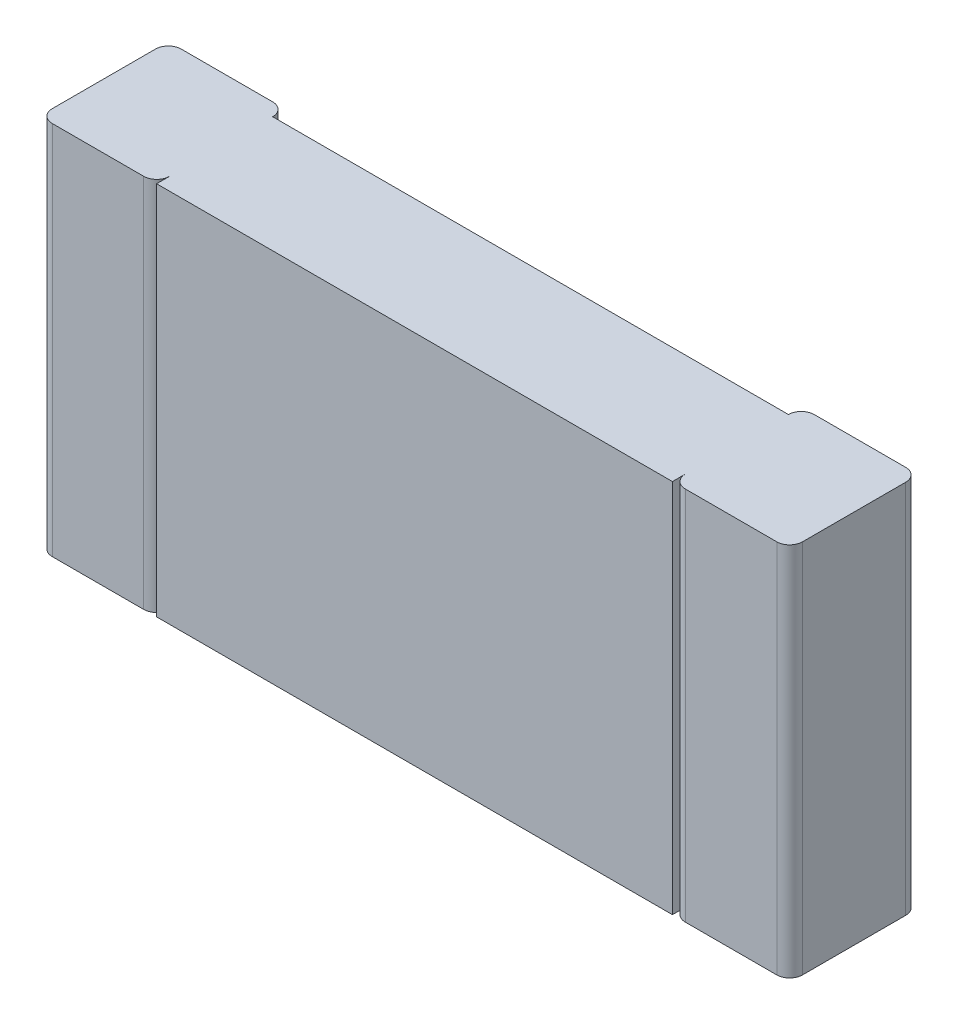
ISO-10303-21;
HEADER;
FILE_DESCRIPTION(('STEP AP214'),'2;1');
FILE_NAME('part.step','',(''),(''),'','','');
FILE_SCHEMA(('AUTOMOTIVE_DESIGN { 1 0 10303 214 1 1 1 1 }'));
ENDSEC;
DATA;
#1=APPLICATION_CONTEXT('core data for automotive mechanical design processes');
#2=APPLICATION_PROTOCOL_DEFINITION('international standard','automotive_design',2000,#1);
#3=PRODUCT_CONTEXT('',#1,'mechanical');
#4=PRODUCT('Part','Part','',(#3));
#5=PRODUCT_RELATED_PRODUCT_CATEGORY('part','',(#4));
#6=PRODUCT_DEFINITION_FORMATION('','',#4);
#7=PRODUCT_DEFINITION_CONTEXT('part definition',#1,'design');
#8=PRODUCT_DEFINITION('design','',#6,#7);
#9=PRODUCT_DEFINITION_SHAPE('','',#8);
#10=(LENGTH_UNIT() NAMED_UNIT(*) SI_UNIT(.MILLI.,.METRE.));
#11=(NAMED_UNIT(*) PLANE_ANGLE_UNIT() SI_UNIT($,.RADIAN.));
#12=(NAMED_UNIT(*) SI_UNIT($,.STERADIAN.) SOLID_ANGLE_UNIT());
#13=UNCERTAINTY_MEASURE_WITH_UNIT(LENGTH_MEASURE(1.E-05),#10,'distance_accuracy_value','');
#14=(GEOMETRIC_REPRESENTATION_CONTEXT(3) GLOBAL_UNCERTAINTY_ASSIGNED_CONTEXT((#13)) GLOBAL_UNIT_ASSIGNED_CONTEXT((#10,
#11,#12)) REPRESENTATION_CONTEXT('',''));
#15=CARTESIAN_POINT('',(0.,0.,0.));
#16=DIRECTION('',(0.,0.,1.));
#17=DIRECTION('',(1.,0.,0.));
#18=AXIS2_PLACEMENT_3D('',#15,#16,#17);
#19=CARTESIAN_POINT('',(-1.545,-0.8,0.055));
#20=DIRECTION('',(0.,1.,0.));
#21=DIRECTION('',(0.,0.,1.));
#22=AXIS2_PLACEMENT_3D('',#19,#20,#21);
#23=CYLINDRICAL_SURFACE('',#22,0.055);
#24=DIRECTION('',(0.,1.,0.));
#25=VECTOR('',#24,1.);
#26=CARTESIAN_POINT('',(-1.545,-0.8,0.));
#27=LINE('',#26,#25);
#28=CARTESIAN_POINT('',(-1.545,0.8,0.));
#29=VERTEX_POINT('',#28);
#30=CARTESIAN_POINT('',(-1.545,-0.8,0.));
#31=VERTEX_POINT('',#30);
#32=EDGE_CURVE('E179',#29,#31,#27,.F.);
#33=ORIENTED_EDGE('',*,*,#32,.T.);
#34=CARTESIAN_POINT('',(-1.545,-0.8,0.055));
#35=DIRECTION('',(0.,1.,0.));
#36=DIRECTION('',(0.,0.,1.));
#37=AXIS2_PLACEMENT_3D('',#34,#35,#36);
#38=CIRCLE('',#37,0.055);
#39=CARTESIAN_POINT('',(-1.6,-0.8,0.055));
#40=VERTEX_POINT('',#39);
#41=EDGE_CURVE('E152',#31,#40,#38,.T.);
#42=ORIENTED_EDGE('',*,*,#41,.T.);
#43=DIRECTION('',(0.,1.,0.));
#44=VECTOR('',#43,1.);
#45=CARTESIAN_POINT('',(-1.6,-0.8,0.055));
#46=LINE('',#45,#44);
#47=CARTESIAN_POINT('',(-1.6,0.8,0.055));
#48=VERTEX_POINT('',#47);
#49=EDGE_CURVE('E155',#40,#48,#46,.T.);
#50=ORIENTED_EDGE('',*,*,#49,.T.);
#51=CARTESIAN_POINT('',(-1.545,0.8,0.055));
#52=DIRECTION('',(0.,1.,0.));
#53=DIRECTION('',(0.,0.,1.));
#54=AXIS2_PLACEMENT_3D('',#51,#52,#53);
#55=CIRCLE('',#54,0.055);
#56=EDGE_CURVE('E22',#48,#29,#55,.F.);
#57=ORIENTED_EDGE('',*,*,#56,.T.);
#58=EDGE_LOOP('',(#33,#42,#50,#57));
#59=FACE_BOUND('',#58,.T.);
#60=ADVANCED_FACE('F19',(#59),#23,.T.);
#61=CARTESIAN_POINT('',(1.545,-0.8,0.055));
#62=DIRECTION('',(0.,1.,0.));
#63=DIRECTION('',(0.,0.,1.));
#64=AXIS2_PLACEMENT_3D('',#61,#62,#63);
#65=CYLINDRICAL_SURFACE('',#64,0.055);
#66=CARTESIAN_POINT('',(1.545,0.8,0.055));
#67=DIRECTION('',(0.,1.,0.));
#68=DIRECTION('',(0.,0.,1.));
#69=AXIS2_PLACEMENT_3D('',#66,#67,#68);
#70=CIRCLE('',#69,0.055);
#71=CARTESIAN_POINT('',(1.545,0.8,0.));
#72=VERTEX_POINT('',#71);
#73=CARTESIAN_POINT('',(1.6,0.8,0.055));
#74=VERTEX_POINT('',#73);
#75=EDGE_CURVE('E173',#72,#74,#70,.F.);
#76=ORIENTED_EDGE('',*,*,#75,.T.);
#77=DIRECTION('',(0.,1.,0.));
#78=VECTOR('',#77,1.);
#79=CARTESIAN_POINT('',(1.6,-0.8,0.055));
#80=LINE('',#79,#78);
#81=CARTESIAN_POINT('',(1.6,-0.8,0.055));
#82=VERTEX_POINT('',#81);
#83=EDGE_CURVE('E167',#82,#74,#80,.T.);
#84=ORIENTED_EDGE('',*,*,#83,.F.);
#85=CARTESIAN_POINT('',(1.545,-0.8,0.055));
#86=DIRECTION('',(0.,1.,0.));
#87=DIRECTION('',(0.,0.,1.));
#88=AXIS2_PLACEMENT_3D('',#85,#86,#87);
#89=CIRCLE('',#88,0.055);
#90=CARTESIAN_POINT('',(1.545,-0.8,0.));
#91=VERTEX_POINT('',#90);
#92=EDGE_CURVE('E225',#82,#91,#89,.T.);
#93=ORIENTED_EDGE('',*,*,#92,.T.);
#94=DIRECTION('',(0.,1.,0.));
#95=VECTOR('',#94,1.);
#96=CARTESIAN_POINT('',(1.545,-0.8,0.));
#97=LINE('',#96,#95);
#98=EDGE_CURVE('E174',#91,#72,#97,.T.);
#99=ORIENTED_EDGE('',*,*,#98,.T.);
#100=EDGE_LOOP('',(#76,#84,#93,#99));
#101=FACE_BOUND('',#100,.T.);
#102=ADVANCED_FACE('F230',(#101),#65,.T.);
#103=CARTESIAN_POINT('',(-1.6,-0.8,0.));
#104=DIRECTION('',(1.,0.,0.));
#105=DIRECTION('',(0.,0.,-1.));
#106=AXIS2_PLACEMENT_3D('',#103,#104,#105);
#107=PLANE('',#106);
#108=DIRECTION('',(0.,0.,-1.));
#109=VECTOR('',#108,1.);
#110=CARTESIAN_POINT('',(-1.6,0.8,0.));
#111=LINE('',#110,#109);
#112=CARTESIAN_POINT('',(-1.6,0.8,0.495));
#113=VERTEX_POINT('',#112);
#114=EDGE_CURVE('E145',#48,#113,#111,.F.);
#115=ORIENTED_EDGE('',*,*,#114,.F.);
#116=ORIENTED_EDGE('',*,*,#49,.F.);
#117=DIRECTION('',(0.,0.,-1.));
#118=VECTOR('',#117,1.);
#119=CARTESIAN_POINT('',(-1.6,-0.8,0.));
#120=LINE('',#119,#118);
#121=CARTESIAN_POINT('',(-1.6,-0.8,0.495));
#122=VERTEX_POINT('',#121);
#123=EDGE_CURVE('E158',#122,#40,#120,.T.);
#124=ORIENTED_EDGE('',*,*,#123,.F.);
#125=DIRECTION('',(0.,1.,0.));
#126=VECTOR('',#125,1.);
#127=CARTESIAN_POINT('',(-1.6,-0.8,0.495));
#128=LINE('',#127,#126);
#129=EDGE_CURVE('E162',#113,#122,#128,.F.);
#130=ORIENTED_EDGE('',*,*,#129,.F.);
#131=EDGE_LOOP('',(#115,#116,#124,#130));
#132=FACE_BOUND('',#131,.T.);
#133=ADVANCED_FACE('F160',(#132),#107,.F.);
#134=CARTESIAN_POINT('',(1.6,-0.8,0.));
#135=DIRECTION('',(1.,0.,0.));
#136=DIRECTION('',(0.,0.,-1.));
#137=AXIS2_PLACEMENT_3D('',#134,#135,#136);
#138=PLANE('',#137);
#139=DIRECTION('',(0.,0.,-1.));
#140=VECTOR('',#139,1.);
#141=CARTESIAN_POINT('',(1.6,0.8,0.));
#142=LINE('',#141,#140);
#143=CARTESIAN_POINT('',(1.6,0.8,0.495));
#144=VERTEX_POINT('',#143);
#145=EDGE_CURVE('E183',#74,#144,#142,.F.);
#146=ORIENTED_EDGE('',*,*,#145,.T.);
#147=DIRECTION('',(0.,1.,0.));
#148=VECTOR('',#147,1.);
#149=CARTESIAN_POINT('',(1.6,-0.8,0.495));
#150=LINE('',#149,#148);
#151=CARTESIAN_POINT('',(1.6,-0.8,0.495));
#152=VERTEX_POINT('',#151);
#153=EDGE_CURVE('E220',#152,#144,#150,.T.);
#154=ORIENTED_EDGE('',*,*,#153,.F.);
#155=DIRECTION('',(0.,0.,-1.));
#156=VECTOR('',#155,1.);
#157=CARTESIAN_POINT('',(1.6,-0.8,0.));
#158=LINE('',#157,#156);
#159=EDGE_CURVE('E164',#152,#82,#158,.T.);
#160=ORIENTED_EDGE('',*,*,#159,.T.);
#161=ORIENTED_EDGE('',*,*,#83,.T.);
#162=EDGE_LOOP('',(#146,#154,#160,#161));
#163=FACE_BOUND('',#162,.T.);
#164=ADVANCED_FACE('F250',(#163),#138,.T.);
#165=CARTESIAN_POINT('',(-1.6,-0.8,0.));
#166=DIRECTION('',(0.,0.,1.));
#167=DIRECTION('',(1.,0.,0.));
#168=AXIS2_PLACEMENT_3D('',#165,#166,#167);
#169=PLANE('',#168);
#170=DIRECTION('',(1.,0.,0.));
#171=VECTOR('',#170,1.);
#172=CARTESIAN_POINT('',(-1.6,-0.8,0.));
#173=LINE('',#172,#171);
#174=CARTESIAN_POINT('',(-1.155,-0.8,0.));
#175=VERTEX_POINT('',#174);
#176=EDGE_CURVE('E181',#31,#175,#173,.T.);
#177=ORIENTED_EDGE('',*,*,#176,.F.);
#178=ORIENTED_EDGE('',*,*,#32,.F.);
#179=DIRECTION('',(1.,0.,0.));
#180=VECTOR('',#179,1.);
#181=CARTESIAN_POINT('',(-1.6,0.8,0.));
#182=LINE('',#181,#180);
#183=CARTESIAN_POINT('',(-1.155,0.8,0.));
#184=VERTEX_POINT('',#183);
#185=EDGE_CURVE('E148',#184,#29,#182,.F.);
#186=ORIENTED_EDGE('',*,*,#185,.F.);
#187=DIRECTION('',(0.,1.,0.));
#188=VECTOR('',#187,1.);
#189=CARTESIAN_POINT('',(-1.155,-0.8,0.));
#190=LINE('',#189,#188);
#191=EDGE_CURVE('E219',#175,#184,#190,.T.);
#192=ORIENTED_EDGE('',*,*,#191,.F.);
#193=EDGE_LOOP('',(#177,#178,#186,#192));
#194=FACE_BOUND('',#193,.T.);
#195=ADVANCED_FACE('F338',(#194),#169,.F.);
#196=CARTESIAN_POINT('',(1.1,-0.8,0.));
#197=DIRECTION('',(0.,0.,1.));
#198=DIRECTION('',(1.,0.,0.));
#199=AXIS2_PLACEMENT_3D('',#196,#197,#198);
#200=PLANE('',#199);
#201=DIRECTION('',(1.,0.,0.));
#202=VECTOR('',#201,1.);
#203=CARTESIAN_POINT('',(1.1,-0.8,0.));
#204=LINE('',#203,#202);
#205=CARTESIAN_POINT('',(1.155,-0.8,0.));
#206=VERTEX_POINT('',#205);
#207=EDGE_CURVE('E178',#206,#91,#204,.T.);
#208=ORIENTED_EDGE('',*,*,#207,.F.);
#209=DIRECTION('',(0.,1.,0.));
#210=VECTOR('',#209,1.);
#211=CARTESIAN_POINT('',(1.155,-0.8,0.));
#212=LINE('',#211,#210);
#213=CARTESIAN_POINT('',(1.155,0.8,0.));
#214=VERTEX_POINT('',#213);
#215=EDGE_CURVE('E238',#214,#206,#212,.F.);
#216=ORIENTED_EDGE('',*,*,#215,.F.);
#217=DIRECTION('',(1.,0.,0.));
#218=VECTOR('',#217,1.);
#219=CARTESIAN_POINT('',(1.1,0.8,0.));
#220=LINE('',#219,#218);
#221=EDGE_CURVE('E237',#72,#214,#220,.F.);
#222=ORIENTED_EDGE('',*,*,#221,.F.);
#223=ORIENTED_EDGE('',*,*,#98,.F.);
#224=EDGE_LOOP('',(#208,#216,#222,#223));
#225=FACE_BOUND('',#224,.T.);
#226=ADVANCED_FACE('F234',(#225),#200,.F.);
#227=CARTESIAN_POINT('',(-1.545,-0.8,0.495));
#228=DIRECTION('',(0.,1.,0.));
#229=DIRECTION('',(0.,0.,1.));
#230=AXIS2_PLACEMENT_3D('',#227,#228,#229);
#231=CYLINDRICAL_SURFACE('',#230,0.055);
#232=CARTESIAN_POINT('',(-1.545,0.8,0.495));
#233=DIRECTION('',(0.,1.,0.));
#234=DIRECTION('',(0.,0.,1.));
#235=AXIS2_PLACEMENT_3D('',#232,#233,#234);
#236=CIRCLE('',#235,0.055);
#237=CARTESIAN_POINT('',(-1.545,0.8,0.55));
#238=VERTEX_POINT('',#237);
#239=EDGE_CURVE('E221',#238,#113,#236,.F.);
#240=ORIENTED_EDGE('',*,*,#239,.T.);
#241=ORIENTED_EDGE('',*,*,#129,.T.);
#242=CARTESIAN_POINT('',(-1.545,-0.8,0.495));
#243=DIRECTION('',(0.,1.,0.));
#244=DIRECTION('',(0.,0.,1.));
#245=AXIS2_PLACEMENT_3D('',#242,#243,#244);
#246=CIRCLE('',#245,0.055);
#247=CARTESIAN_POINT('',(-1.545,-0.8,0.55));
#248=VERTEX_POINT('',#247);
#249=EDGE_CURVE('E177',#122,#248,#246,.T.);
#250=ORIENTED_EDGE('',*,*,#249,.T.);
#251=DIRECTION('',(0.,1.,0.));
#252=VECTOR('',#251,1.);
#253=CARTESIAN_POINT('',(-1.545,-0.8,0.55));
#254=LINE('',#253,#252);
#255=EDGE_CURVE('E262',#238,#248,#254,.F.);
#256=ORIENTED_EDGE('',*,*,#255,.F.);
#257=EDGE_LOOP('',(#240,#241,#250,#256));
#258=FACE_BOUND('',#257,.T.);
#259=ADVANCED_FACE('F259',(#258),#231,.T.);
#260=CARTESIAN_POINT('',(1.545,-0.8,0.495));
#261=DIRECTION('',(0.,1.,0.));
#262=DIRECTION('',(0.,0.,1.));
#263=AXIS2_PLACEMENT_3D('',#260,#261,#262);
#264=CYLINDRICAL_SURFACE('',#263,0.055);
#265=DIRECTION('',(0.,1.,0.));
#266=VECTOR('',#265,1.);
#267=CARTESIAN_POINT('',(1.545,-0.8,0.55));
#268=LINE('',#267,#266);
#269=CARTESIAN_POINT('',(1.545,-0.8,0.55));
#270=VERTEX_POINT('',#269);
#271=CARTESIAN_POINT('',(1.545,0.8,0.55));
#272=VERTEX_POINT('',#271);
#273=EDGE_CURVE('E268',#270,#272,#268,.T.);
#274=ORIENTED_EDGE('',*,*,#273,.F.);
#275=CARTESIAN_POINT('',(1.545,-0.8,0.495));
#276=DIRECTION('',(0.,1.,0.));
#277=DIRECTION('',(0.,0.,1.));
#278=AXIS2_PLACEMENT_3D('',#275,#276,#277);
#279=CIRCLE('',#278,0.055);
#280=EDGE_CURVE('E207',#270,#152,#279,.T.);
#281=ORIENTED_EDGE('',*,*,#280,.T.);
#282=ORIENTED_EDGE('',*,*,#153,.T.);
#283=CARTESIAN_POINT('',(1.545,0.8,0.495));
#284=DIRECTION('',(0.,1.,0.));
#285=DIRECTION('',(0.,0.,1.));
#286=AXIS2_PLACEMENT_3D('',#283,#284,#285);
#287=CIRCLE('',#286,0.055);
#288=EDGE_CURVE('E217',#144,#272,#287,.F.);
#289=ORIENTED_EDGE('',*,*,#288,.T.);
#290=EDGE_LOOP('',(#274,#281,#282,#289));
#291=FACE_BOUND('',#290,.T.);
#292=ADVANCED_FACE('F257',(#291),#264,.T.);
#293=CARTESIAN_POINT('',(-1.155,-0.8,0.055));
#294=DIRECTION('',(0.,1.,0.));
#295=DIRECTION('',(0.,0.,1.));
#296=AXIS2_PLACEMENT_3D('',#293,#294,#295);
#297=CYLINDRICAL_SURFACE('',#296,0.055);
#298=CARTESIAN_POINT('',(-1.155,0.8,0.055));
#299=DIRECTION('',(0.,1.,0.));
#300=DIRECTION('',(0.,0.,1.));
#301=AXIS2_PLACEMENT_3D('',#298,#299,#300);
#302=CIRCLE('',#301,0.055);
#303=CARTESIAN_POINT('',(-1.1,0.8,0.055));
#304=VERTEX_POINT('',#303);
#305=EDGE_CURVE('E204',#304,#184,#302,.T.);
#306=ORIENTED_EDGE('',*,*,#305,.F.);
#307=DIRECTION('',(0.,1.,0.));
#308=VECTOR('',#307,1.);
#309=CARTESIAN_POINT('',(-1.1,-0.8,0.055));
#310=LINE('',#309,#308);
#311=CARTESIAN_POINT('',(-1.1,-0.8,0.055));
#312=VERTEX_POINT('',#311);
#313=EDGE_CURVE('E294',#304,#312,#310,.F.);
#314=ORIENTED_EDGE('',*,*,#313,.T.);
#315=CARTESIAN_POINT('',(-1.155,-0.8,0.055));
#316=DIRECTION('',(0.,1.,0.));
#317=DIRECTION('',(0.,0.,1.));
#318=AXIS2_PLACEMENT_3D('',#315,#316,#317);
#319=CIRCLE('',#318,0.055);
#320=EDGE_CURVE('E213',#312,#175,#319,.T.);
#321=ORIENTED_EDGE('',*,*,#320,.T.);
#322=ORIENTED_EDGE('',*,*,#191,.T.);
#323=EDGE_LOOP('',(#306,#314,#321,#322));
#324=FACE_BOUND('',#323,.T.);
#325=ADVANCED_FACE('F334',(#324),#297,.T.);
#326=CARTESIAN_POINT('',(1.155,-0.8,0.055));
#327=DIRECTION('',(0.,1.,0.));
#328=DIRECTION('',(0.,0.,1.));
#329=AXIS2_PLACEMENT_3D('',#326,#327,#328);
#330=CYLINDRICAL_SURFACE('',#329,0.055);
#331=ORIENTED_EDGE('',*,*,#215,.T.);
#332=CARTESIAN_POINT('',(1.155,-0.8,0.055));
#333=DIRECTION('',(0.,1.,0.));
#334=DIRECTION('',(0.,0.,1.));
#335=AXIS2_PLACEMENT_3D('',#332,#333,#334);
#336=CIRCLE('',#335,0.055);
#337=CARTESIAN_POINT('',(1.1,-0.8,0.055));
#338=VERTEX_POINT('',#337);
#339=EDGE_CURVE('E211',#206,#338,#336,.T.);
#340=ORIENTED_EDGE('',*,*,#339,.T.);
#341=DIRECTION('',(0.,1.,0.));
#342=VECTOR('',#341,1.);
#343=CARTESIAN_POINT('',(1.1,-0.8,0.055));
#344=LINE('',#343,#342);
#345=CARTESIAN_POINT('',(1.1,0.8,0.055));
#346=VERTEX_POINT('',#345);
#347=EDGE_CURVE('E199',#338,#346,#344,.T.);
#348=ORIENTED_EDGE('',*,*,#347,.T.);
#349=CARTESIAN_POINT('',(1.155,0.8,0.055));
#350=DIRECTION('',(0.,1.,0.));
#351=DIRECTION('',(0.,0.,1.));
#352=AXIS2_PLACEMENT_3D('',#349,#350,#351);
#353=CIRCLE('',#352,0.055);
#354=EDGE_CURVE('E200',#214,#346,#353,.T.);
#355=ORIENTED_EDGE('',*,*,#354,.F.);
#356=EDGE_LOOP('',(#331,#340,#348,#355));
#357=FACE_BOUND('',#356,.T.);
#358=ADVANCED_FACE('F325',(#357),#330,.T.);
#359=CARTESIAN_POINT('',(-1.6,-0.8,0.55));
#360=DIRECTION('',(0.,0.,1.));
#361=DIRECTION('',(1.,0.,0.));
#362=AXIS2_PLACEMENT_3D('',#359,#360,#361);
#363=PLANE('',#362);
#364=DIRECTION('',(1.,0.,0.));
#365=VECTOR('',#364,1.);
#366=CARTESIAN_POINT('',(-1.6,-0.8,0.55));
#367=LINE('',#366,#365);
#368=CARTESIAN_POINT('',(-1.155,-0.8,0.55));
#369=VERTEX_POINT('',#368);
#370=EDGE_CURVE('E216',#248,#369,#367,.T.);
#371=ORIENTED_EDGE('',*,*,#370,.T.);
#372=DIRECTION('',(0.,1.,0.));
#373=VECTOR('',#372,1.);
#374=CARTESIAN_POINT('',(-1.155,-0.8,0.55));
#375=LINE('',#374,#373);
#376=CARTESIAN_POINT('',(-1.155,0.8,0.55));
#377=VERTEX_POINT('',#376);
#378=EDGE_CURVE('E195',#377,#369,#375,.F.);
#379=ORIENTED_EDGE('',*,*,#378,.F.);
#380=DIRECTION('',(1.,0.,0.));
#381=VECTOR('',#380,1.);
#382=CARTESIAN_POINT('',(-1.6,0.8,0.55));
#383=LINE('',#382,#381);
#384=EDGE_CURVE('E206',#238,#377,#383,.T.);
#385=ORIENTED_EDGE('',*,*,#384,.F.);
#386=ORIENTED_EDGE('',*,*,#255,.T.);
#387=EDGE_LOOP('',(#371,#379,#385,#386));
#388=FACE_BOUND('',#387,.T.);
#389=ADVANCED_FACE('F271',(#388),#363,.T.);
#390=CARTESIAN_POINT('',(1.1,-0.8,0.55));
#391=DIRECTION('',(0.,0.,1.));
#392=DIRECTION('',(1.,0.,0.));
#393=AXIS2_PLACEMENT_3D('',#390,#391,#392);
#394=PLANE('',#393);
#395=DIRECTION('',(1.,0.,0.));
#396=VECTOR('',#395,1.);
#397=CARTESIAN_POINT('',(1.1,-0.8,0.55));
#398=LINE('',#397,#396);
#399=CARTESIAN_POINT('',(1.155,-0.8,0.55));
#400=VERTEX_POINT('',#399);
#401=EDGE_CURVE('E210',#400,#270,#398,.T.);
#402=ORIENTED_EDGE('',*,*,#401,.T.);
#403=ORIENTED_EDGE('',*,*,#273,.T.);
#404=DIRECTION('',(1.,0.,0.));
#405=VECTOR('',#404,1.);
#406=CARTESIAN_POINT('',(1.1,0.8,0.55));
#407=LINE('',#406,#405);
#408=CARTESIAN_POINT('',(1.155,0.8,0.55));
#409=VERTEX_POINT('',#408);
#410=EDGE_CURVE('E203',#409,#272,#407,.T.);
#411=ORIENTED_EDGE('',*,*,#410,.F.);
#412=DIRECTION('',(0.,1.,0.));
#413=VECTOR('',#412,1.);
#414=CARTESIAN_POINT('',(1.155,-0.8,0.55));
#415=LINE('',#414,#413);
#416=EDGE_CURVE('E188',#400,#409,#415,.T.);
#417=ORIENTED_EDGE('',*,*,#416,.F.);
#418=EDGE_LOOP('',(#402,#403,#411,#417));
#419=FACE_BOUND('',#418,.T.);
#420=ADVANCED_FACE('F370',(#419),#394,.T.);
#421=CARTESIAN_POINT('',(-1.545,-0.8,0.055));
#422=DIRECTION('',(0.,0.,1.));
#423=DIRECTION('',(1.,0.,0.));
#424=AXIS2_PLACEMENT_3D('',#421,#422,#423);
#425=PLANE('',#424);
#426=ORIENTED_EDGE('',*,*,#347,.F.);
#427=DIRECTION('',(1.,0.,0.));
#428=VECTOR('',#427,1.);
#429=CARTESIAN_POINT('',(-1.545,-0.8,0.055));
#430=LINE('',#429,#428);
#431=EDGE_CURVE('E192',#338,#312,#430,.F.);
#432=ORIENTED_EDGE('',*,*,#431,.T.);
#433=ORIENTED_EDGE('',*,*,#313,.F.);
#434=DIRECTION('',(1.,0.,0.));
#435=VECTOR('',#434,1.);
#436=CARTESIAN_POINT('',(-1.545,0.8,0.055));
#437=LINE('',#436,#435);
#438=EDGE_CURVE('E187',#346,#304,#437,.F.);
#439=ORIENTED_EDGE('',*,*,#438,.F.);
#440=EDGE_LOOP('',(#426,#432,#433,#439));
#441=FACE_BOUND('',#440,.T.);
#442=ADVANCED_FACE('F331',(#441),#425,.F.);
#443=CARTESIAN_POINT('',(-1.155,-0.8,0.495));
#444=DIRECTION('',(0.,1.,0.));
#445=DIRECTION('',(0.,0.,1.));
#446=AXIS2_PLACEMENT_3D('',#443,#444,#445);
#447=CYLINDRICAL_SURFACE('',#446,0.055);
#448=ORIENTED_EDGE('',*,*,#378,.T.);
#449=CARTESIAN_POINT('',(-1.155,-0.8,0.495));
#450=DIRECTION('',(0.,1.,0.));
#451=DIRECTION('',(0.,0.,1.));
#452=AXIS2_PLACEMENT_3D('',#449,#450,#451);
#453=CIRCLE('',#452,0.055);
#454=CARTESIAN_POINT('',(-1.1,-0.8,0.495));
#455=VERTEX_POINT('',#454);
#456=EDGE_CURVE('E193',#369,#455,#453,.T.);
#457=ORIENTED_EDGE('',*,*,#456,.T.);
#458=DIRECTION('',(0.,1.,0.));
#459=VECTOR('',#458,1.);
#460=CARTESIAN_POINT('',(-1.1,-0.8,0.495));
#461=LINE('',#460,#459);
#462=CARTESIAN_POINT('',(-1.1,0.8,0.495));
#463=VERTEX_POINT('',#462);
#464=EDGE_CURVE('E278',#455,#463,#461,.T.);
#465=ORIENTED_EDGE('',*,*,#464,.T.);
#466=CARTESIAN_POINT('',(-1.155,0.8,0.495));
#467=DIRECTION('',(0.,1.,0.));
#468=DIRECTION('',(0.,0.,1.));
#469=AXIS2_PLACEMENT_3D('',#466,#467,#468);
#470=CIRCLE('',#469,0.055);
#471=EDGE_CURVE('E196',#463,#377,#470,.F.);
#472=ORIENTED_EDGE('',*,*,#471,.T.);
#473=EDGE_LOOP('',(#448,#457,#465,#472));
#474=FACE_BOUND('',#473,.T.);
#475=ADVANCED_FACE('F276',(#474),#447,.T.);
#476=CARTESIAN_POINT('',(1.155,-0.8,0.495));
#477=DIRECTION('',(0.,1.,0.));
#478=DIRECTION('',(0.,0.,1.));
#479=AXIS2_PLACEMENT_3D('',#476,#477,#478);
#480=CYLINDRICAL_SURFACE('',#479,0.055);
#481=CARTESIAN_POINT('',(1.155,0.8,0.495));
#482=DIRECTION('',(0.,1.,0.));
#483=DIRECTION('',(0.,0.,1.));
#484=AXIS2_PLACEMENT_3D('',#481,#482,#483);
#485=CIRCLE('',#484,0.055);
#486=CARTESIAN_POINT('',(1.1,0.8,0.495));
#487=VERTEX_POINT('',#486);
#488=EDGE_CURVE('E185',#409,#487,#485,.F.);
#489=ORIENTED_EDGE('',*,*,#488,.T.);
#490=DIRECTION('',(0.,1.,0.));
#491=VECTOR('',#490,1.);
#492=CARTESIAN_POINT('',(1.1,-0.8,0.495));
#493=LINE('',#492,#491);
#494=CARTESIAN_POINT('',(1.1,-0.8,0.495));
#495=VERTEX_POINT('',#494);
#496=EDGE_CURVE('E288',#495,#487,#493,.T.);
#497=ORIENTED_EDGE('',*,*,#496,.F.);
#498=CARTESIAN_POINT('',(1.155,-0.8,0.495));
#499=DIRECTION('',(0.,1.,0.));
#500=DIRECTION('',(0.,0.,1.));
#501=AXIS2_PLACEMENT_3D('',#498,#499,#500);
#502=CIRCLE('',#501,0.055);
#503=EDGE_CURVE('E189',#495,#400,#502,.T.);
#504=ORIENTED_EDGE('',*,*,#503,.T.);
#505=ORIENTED_EDGE('',*,*,#416,.T.);
#506=EDGE_LOOP('',(#489,#497,#504,#505));
#507=FACE_BOUND('',#506,.T.);
#508=ADVANCED_FACE('F362',(#507),#480,.T.);
#509=CARTESIAN_POINT('',(-1.1,-0.8,0.495));
#510=DIRECTION('',(1.,0.,0.));
#511=DIRECTION('',(0.,0.,-1.));
#512=AXIS2_PLACEMENT_3D('',#509,#510,#511);
#513=PLANE('',#512);
#514=DIRECTION('',(0.,0.,1.));
#515=VECTOR('',#514,1.);
#516=CARTESIAN_POINT('',(-1.1,0.8,0.495));
#517=LINE('',#516,#515);
#518=CARTESIAN_POINT('',(-1.1,0.8,0.55));
#519=VERTEX_POINT('',#518);
#520=EDGE_CURVE('E284',#463,#519,#517,.T.);
#521=ORIENTED_EDGE('',*,*,#520,.F.);
#522=ORIENTED_EDGE('',*,*,#464,.F.);
#523=DIRECTION('',(0.,0.,1.));
#524=VECTOR('',#523,1.);
#525=CARTESIAN_POINT('',(-1.1,-0.8,0.495));
#526=LINE('',#525,#524);
#527=CARTESIAN_POINT('',(-1.1,-0.8,0.55));
#528=VERTEX_POINT('',#527);
#529=EDGE_CURVE('E282',#455,#528,#526,.T.);
#530=ORIENTED_EDGE('',*,*,#529,.T.);
#531=DIRECTION('',(0.,1.,0.));
#532=VECTOR('',#531,1.);
#533=CARTESIAN_POINT('',(-1.1,-0.8,0.55));
#534=LINE('',#533,#532);
#535=EDGE_CURVE('E287',#519,#528,#534,.F.);
#536=ORIENTED_EDGE('',*,*,#535,.F.);
#537=EDGE_LOOP('',(#521,#522,#530,#536));
#538=FACE_BOUND('',#537,.T.);
#539=ADVANCED_FACE('F285',(#538),#513,.F.);
#540=CARTESIAN_POINT('',(-1.1,-0.8,0.495));
#541=DIRECTION('',(0.,1.,0.));
#542=DIRECTION('',(0.,0.,1.));
#543=AXIS2_PLACEMENT_3D('',#540,#541,#542);
#544=PLANE('',#543);
#545=DIRECTION('',(1.,0.,0.));
#546=VECTOR('',#545,1.);
#547=CARTESIAN_POINT('',(-1.1,-0.8,0.55));
#548=LINE('',#547,#546);
#549=CARTESIAN_POINT('',(1.1,-0.8,0.55));
#550=VERTEX_POINT('',#549);
#551=EDGE_CURVE('E312',#528,#550,#548,.T.);
#552=ORIENTED_EDGE('',*,*,#551,.F.);
#553=ORIENTED_EDGE('',*,*,#529,.F.);
#554=ORIENTED_EDGE('',*,*,#456,.F.);
#555=ORIENTED_EDGE('',*,*,#370,.F.);
#556=ORIENTED_EDGE('',*,*,#249,.F.);
#557=ORIENTED_EDGE('',*,*,#123,.T.);
#558=ORIENTED_EDGE('',*,*,#41,.F.);
#559=ORIENTED_EDGE('',*,*,#176,.T.);
#560=ORIENTED_EDGE('',*,*,#320,.F.);
#561=ORIENTED_EDGE('',*,*,#431,.F.);
#562=ORIENTED_EDGE('',*,*,#339,.F.);
#563=ORIENTED_EDGE('',*,*,#207,.T.);
#564=ORIENTED_EDGE('',*,*,#92,.F.);
#565=ORIENTED_EDGE('',*,*,#159,.F.);
#566=ORIENTED_EDGE('',*,*,#280,.F.);
#567=ORIENTED_EDGE('',*,*,#401,.F.);
#568=ORIENTED_EDGE('',*,*,#503,.F.);
#569=DIRECTION('',(0.,0.,-1.));
#570=VECTOR('',#569,1.);
#571=CARTESIAN_POINT('',(1.1,-0.8,0.495));
#572=LINE('',#571,#570);
#573=EDGE_CURVE('E291',#550,#495,#572,.T.);
#574=ORIENTED_EDGE('',*,*,#573,.F.);
#575=EDGE_LOOP('',(#552,#553,#554,#555,#556,#557,#558,#559,#560,#561,#562,#563,#564,#565,#566,
#567,#568,#574));
#576=FACE_BOUND('',#575,.T.);
#577=ADVANCED_FACE('F310',(#576),#544,.F.);
#578=CARTESIAN_POINT('',(1.1,-0.8,0.495));
#579=DIRECTION('',(1.,0.,0.));
#580=DIRECTION('',(0.,0.,-1.));
#581=AXIS2_PLACEMENT_3D('',#578,#579,#580);
#582=PLANE('',#581);
#583=DIRECTION('',(0.,0.,1.));
#584=VECTOR('',#583,1.);
#585=CARTESIAN_POINT('',(1.1,0.8,0.495));
#586=LINE('',#585,#584);
#587=CARTESIAN_POINT('',(1.1,0.8,0.55));
#588=VERTEX_POINT('',#587);
#589=EDGE_CURVE('E37',#588,#487,#586,.F.);
#590=ORIENTED_EDGE('',*,*,#589,.F.);
#591=DIRECTION('',(0.,1.,0.));
#592=VECTOR('',#591,1.);
#593=CARTESIAN_POINT('',(1.1,-0.8,0.55));
#594=LINE('',#593,#592);
#595=EDGE_CURVE('E28',#550,#588,#594,.T.);
#596=ORIENTED_EDGE('',*,*,#595,.F.);
#597=ORIENTED_EDGE('',*,*,#573,.T.);
#598=ORIENTED_EDGE('',*,*,#496,.T.);
#599=EDGE_LOOP('',(#590,#596,#597,#598));
#600=FACE_BOUND('',#599,.T.);
#601=ADVANCED_FACE('F353',(#600),#582,.T.);
#602=CARTESIAN_POINT('',(-1.1,0.8,0.495));
#603=DIRECTION('',(0.,1.,0.));
#604=DIRECTION('',(0.,0.,1.));
#605=AXIS2_PLACEMENT_3D('',#602,#603,#604);
#606=PLANE('',#605);
#607=DIRECTION('',(1.,0.,0.));
#608=VECTOR('',#607,1.);
#609=CARTESIAN_POINT('',(-1.1,0.8,0.55));
#610=LINE('',#609,#608);
#611=EDGE_CURVE('E11',#588,#519,#610,.F.);
#612=ORIENTED_EDGE('',*,*,#611,.F.);
#613=ORIENTED_EDGE('',*,*,#589,.T.);
#614=ORIENTED_EDGE('',*,*,#488,.F.);
#615=ORIENTED_EDGE('',*,*,#410,.T.);
#616=ORIENTED_EDGE('',*,*,#288,.F.);
#617=ORIENTED_EDGE('',*,*,#145,.F.);
#618=ORIENTED_EDGE('',*,*,#75,.F.);
#619=ORIENTED_EDGE('',*,*,#221,.T.);
#620=ORIENTED_EDGE('',*,*,#354,.T.);
#621=ORIENTED_EDGE('',*,*,#438,.T.);
#622=ORIENTED_EDGE('',*,*,#305,.T.);
#623=ORIENTED_EDGE('',*,*,#185,.T.);
#624=ORIENTED_EDGE('',*,*,#56,.F.);
#625=ORIENTED_EDGE('',*,*,#114,.T.);
#626=ORIENTED_EDGE('',*,*,#239,.F.);
#627=ORIENTED_EDGE('',*,*,#384,.T.);
#628=ORIENTED_EDGE('',*,*,#471,.F.);
#629=ORIENTED_EDGE('',*,*,#520,.T.);
#630=EDGE_LOOP('',(#612,#613,#614,#615,#616,#617,#618,#619,#620,#621,#622,#623,#624,#625,#626,
#627,#628,#629));
#631=FACE_BOUND('',#630,.T.);
#632=ADVANCED_FACE('F143',(#631),#606,.T.);
#633=CARTESIAN_POINT('',(-1.1,-0.8,0.55));
#634=DIRECTION('',(0.,0.,1.));
#635=DIRECTION('',(1.,0.,0.));
#636=AXIS2_PLACEMENT_3D('',#633,#634,#635);
#637=PLANE('',#636);
#638=ORIENTED_EDGE('',*,*,#595,.T.);
#639=ORIENTED_EDGE('',*,*,#611,.T.);
#640=ORIENTED_EDGE('',*,*,#535,.T.);
#641=ORIENTED_EDGE('',*,*,#551,.T.);
#642=EDGE_LOOP('',(#638,#639,#640,#641));
#643=FACE_BOUND('',#642,.T.);
#644=ADVANCED_FACE('F316',(#643),#637,.T.);
#645=CLOSED_SHELL('',(#60,#102,#133,#164,#195,#226,#259,#292,#325,#358,#389,#420,#442,#475,#508,
#539,#577,#601,#632,#644));
#646=MANIFOLD_SOLID_BREP('B1',#645);
#647=ADVANCED_BREP_SHAPE_REPRESENTATION('',(#18,#646),#14);
#648=SHAPE_DEFINITION_REPRESENTATION(#9,#647);
ENDSEC;
END-ISO-10303-21;
